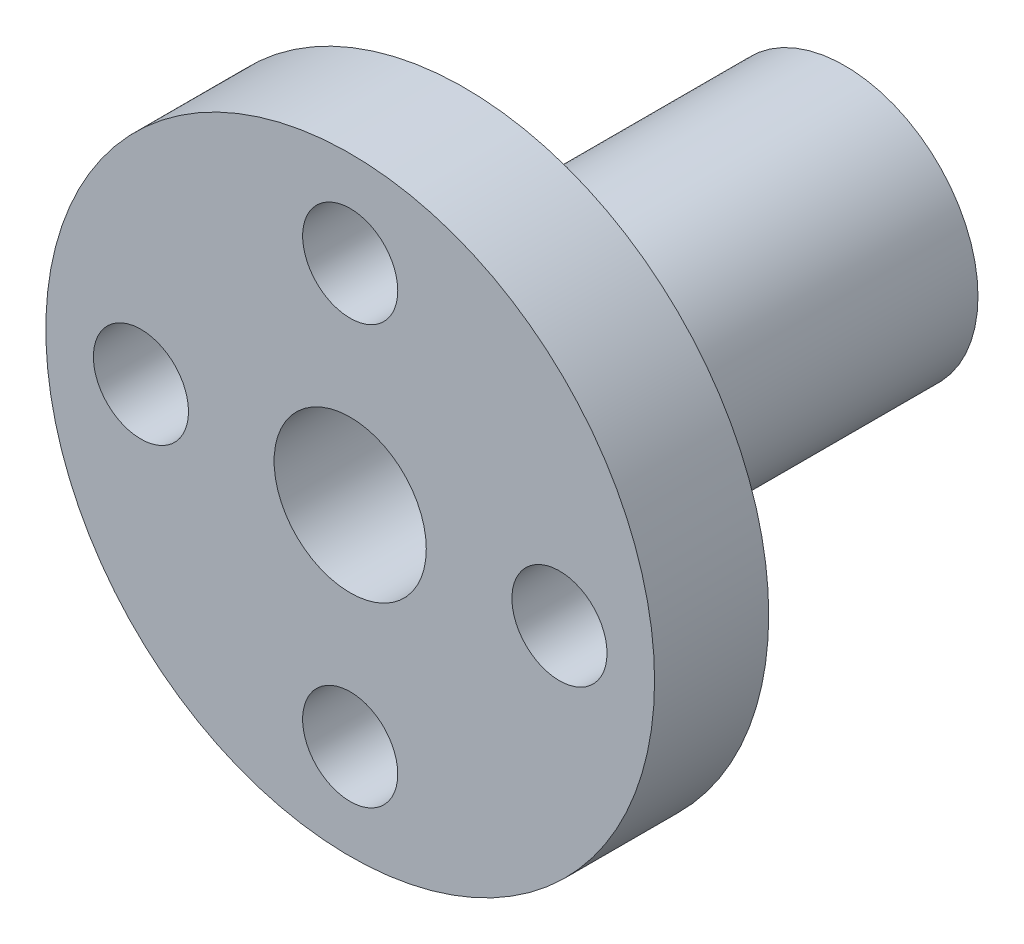
ISO-10303-21;
HEADER;
FILE_DESCRIPTION(('STEP AP214'),'2;1');
FILE_NAME('part.step','',(''),(''),'','','');
FILE_SCHEMA(('AUTOMOTIVE_DESIGN { 1 0 10303 214 1 1 1 1 }'));
ENDSEC;
DATA;
#1=APPLICATION_CONTEXT('core data for automotive mechanical design processes');
#2=APPLICATION_PROTOCOL_DEFINITION('international standard','automotive_design',2000,#1);
#3=PRODUCT_CONTEXT('',#1,'mechanical');
#4=PRODUCT('Part','Part','',(#3));
#5=PRODUCT_RELATED_PRODUCT_CATEGORY('part','',(#4));
#6=PRODUCT_DEFINITION_FORMATION('','',#4);
#7=PRODUCT_DEFINITION_CONTEXT('part definition',#1,'design');
#8=PRODUCT_DEFINITION('design','',#6,#7);
#9=PRODUCT_DEFINITION_SHAPE('','',#8);
#10=(LENGTH_UNIT() NAMED_UNIT(*) SI_UNIT(.MILLI.,.METRE.));
#11=(NAMED_UNIT(*) PLANE_ANGLE_UNIT() SI_UNIT($,.RADIAN.));
#12=(NAMED_UNIT(*) SI_UNIT($,.STERADIAN.) SOLID_ANGLE_UNIT());
#13=UNCERTAINTY_MEASURE_WITH_UNIT(LENGTH_MEASURE(1.E-05),#10,'distance_accuracy_value','');
#14=(GEOMETRIC_REPRESENTATION_CONTEXT(3) GLOBAL_UNCERTAINTY_ASSIGNED_CONTEXT((#13)) GLOBAL_UNIT_ASSIGNED_CONTEXT((#10,
#11,#12)) REPRESENTATION_CONTEXT('',''));
#15=CARTESIAN_POINT('',(0.,0.,0.));
#16=DIRECTION('',(0.,0.,1.));
#17=DIRECTION('',(1.,0.,0.));
#18=AXIS2_PLACEMENT_3D('',#15,#16,#17);
#19=CARTESIAN_POINT('',(0.,0.,3.));
#20=DIRECTION('',(0.,0.,1.));
#21=DIRECTION('',(1.,0.,0.));
#22=AXIS2_PLACEMENT_3D('',#19,#20,#21);
#23=PLANE('',#22);
#24=CARTESIAN_POINT('',(0.,0.,3.));
#25=DIRECTION('',(0.,0.,1.));
#26=DIRECTION('',(1.,0.,0.));
#27=AXIS2_PLACEMENT_3D('',#24,#25,#26);
#28=CIRCLE('',#27,2.);
#29=CARTESIAN_POINT('',(2.,0.,3.));
#30=VERTEX_POINT('',#29);
#31=EDGE_CURVE('E96',#30,#30,#28,.T.);
#32=ORIENTED_EDGE('',*,*,#31,.F.);
#33=EDGE_LOOP('',(#32));
#34=FACE_BOUND('',#33,.T.);
#35=CARTESIAN_POINT('',(0.,-5.5,3.));
#36=DIRECTION('',(0.,0.,1.));
#37=DIRECTION('',(1.,0.,0.));
#38=AXIS2_PLACEMENT_3D('',#35,#36,#37);
#39=CIRCLE('',#38,1.25);
#40=CARTESIAN_POINT('',(1.25,-5.5,3.));
#41=VERTEX_POINT('',#40);
#42=EDGE_CURVE('E68',#41,#41,#39,.T.);
#43=ORIENTED_EDGE('',*,*,#42,.F.);
#44=EDGE_LOOP('',(#43));
#45=FACE_BOUND('',#44,.T.);
#46=CARTESIAN_POINT('',(0.,5.5,3.));
#47=DIRECTION('',(0.,0.,1.));
#48=DIRECTION('',(1.,0.,0.));
#49=AXIS2_PLACEMENT_3D('',#46,#47,#48);
#50=CIRCLE('',#49,1.25);
#51=CARTESIAN_POINT('',(1.25,5.5,3.));
#52=VERTEX_POINT('',#51);
#53=EDGE_CURVE('E54',#52,#52,#50,.T.);
#54=ORIENTED_EDGE('',*,*,#53,.F.);
#55=EDGE_LOOP('',(#54));
#56=FACE_BOUND('',#55,.T.);
#57=CARTESIAN_POINT('',(0.,0.,3.));
#58=DIRECTION('',(0.,0.,1.));
#59=DIRECTION('',(1.,0.,0.));
#60=AXIS2_PLACEMENT_3D('',#57,#58,#59);
#61=CIRCLE('',#60,8.);
#62=CARTESIAN_POINT('',(8.,0.,3.));
#63=VERTEX_POINT('',#62);
#64=EDGE_CURVE('E10',#63,#63,#61,.T.);
#65=ORIENTED_EDGE('',*,*,#64,.T.);
#66=EDGE_LOOP('',(#65));
#67=FACE_BOUND('',#66,.T.);
#68=CARTESIAN_POINT('',(5.5,0.,3.));
#69=DIRECTION('',(0.,0.,1.));
#70=DIRECTION('',(1.,0.,0.));
#71=AXIS2_PLACEMENT_3D('',#68,#69,#70);
#72=CIRCLE('',#71,1.25);
#73=CARTESIAN_POINT('',(6.75,0.,3.));
#74=VERTEX_POINT('',#73);
#75=EDGE_CURVE('E60',#74,#74,#72,.T.);
#76=ORIENTED_EDGE('',*,*,#75,.F.);
#77=EDGE_LOOP('',(#76));
#78=FACE_BOUND('',#77,.T.);
#79=CARTESIAN_POINT('',(-5.5,0.,3.));
#80=DIRECTION('',(0.,0.,1.));
#81=DIRECTION('',(1.,0.,0.));
#82=AXIS2_PLACEMENT_3D('',#79,#80,#81);
#83=CIRCLE('',#82,1.25);
#84=CARTESIAN_POINT('',(-4.25,0.,3.));
#85=VERTEX_POINT('',#84);
#86=EDGE_CURVE('E76',#85,#85,#83,.T.);
#87=ORIENTED_EDGE('',*,*,#86,.F.);
#88=EDGE_LOOP('',(#87));
#89=FACE_BOUND('',#88,.T.);
#90=ADVANCED_FACE('F41',(#34,#45,#56,#67,#78,#89),#23,.T.);
#91=CARTESIAN_POINT('',(0.,0.,0.));
#92=DIRECTION('',(0.,0.,1.));
#93=DIRECTION('',(1.,0.,0.));
#94=AXIS2_PLACEMENT_3D('',#91,#92,#93);
#95=PLANE('',#94);
#96=CARTESIAN_POINT('',(0.,0.,0.));
#97=DIRECTION('',(0.,0.,1.));
#98=DIRECTION('',(1.,0.,0.));
#99=AXIS2_PLACEMENT_3D('',#96,#97,#98);
#100=CIRCLE('',#99,3.5);
#101=CARTESIAN_POINT('',(3.5,0.,0.));
#102=VERTEX_POINT('',#101);
#103=EDGE_CURVE('E88',#102,#102,#100,.T.);
#104=ORIENTED_EDGE('',*,*,#103,.T.);
#105=EDGE_LOOP('',(#104));
#106=FACE_BOUND('',#105,.T.);
#107=CARTESIAN_POINT('',(0.,0.,0.));
#108=DIRECTION('',(0.,0.,1.));
#109=DIRECTION('',(1.,0.,0.));
#110=AXIS2_PLACEMENT_3D('',#107,#108,#109);
#111=CIRCLE('',#110,8.);
#112=CARTESIAN_POINT('',(8.,0.,0.));
#113=VERTEX_POINT('',#112);
#114=EDGE_CURVE('E45',#113,#113,#111,.T.);
#115=ORIENTED_EDGE('',*,*,#114,.F.);
#116=EDGE_LOOP('',(#115));
#117=FACE_BOUND('',#116,.T.);
#118=CARTESIAN_POINT('',(0.,5.5,0.));
#119=DIRECTION('',(0.,0.,1.));
#120=DIRECTION('',(1.,0.,0.));
#121=AXIS2_PLACEMENT_3D('',#118,#119,#120);
#122=CIRCLE('',#121,1.25);
#123=CARTESIAN_POINT('',(1.25,5.5,0.));
#124=VERTEX_POINT('',#123);
#125=EDGE_CURVE('E56',#124,#124,#122,.T.);
#126=ORIENTED_EDGE('',*,*,#125,.T.);
#127=EDGE_LOOP('',(#126));
#128=FACE_BOUND('',#127,.T.);
#129=CARTESIAN_POINT('',(5.5,0.,0.));
#130=DIRECTION('',(0.,0.,1.));
#131=DIRECTION('',(1.,0.,0.));
#132=AXIS2_PLACEMENT_3D('',#129,#130,#131);
#133=CIRCLE('',#132,1.25);
#134=CARTESIAN_POINT('',(6.75,0.,0.));
#135=VERTEX_POINT('',#134);
#136=EDGE_CURVE('E64',#135,#135,#133,.T.);
#137=ORIENTED_EDGE('',*,*,#136,.T.);
#138=EDGE_LOOP('',(#137));
#139=FACE_BOUND('',#138,.T.);
#140=CARTESIAN_POINT('',(0.,-5.5,0.));
#141=DIRECTION('',(0.,0.,1.));
#142=DIRECTION('',(1.,0.,0.));
#143=AXIS2_PLACEMENT_3D('',#140,#141,#142);
#144=CIRCLE('',#143,1.25);
#145=CARTESIAN_POINT('',(1.25,-5.5,0.));
#146=VERTEX_POINT('',#145);
#147=EDGE_CURVE('E72',#146,#146,#144,.T.);
#148=ORIENTED_EDGE('',*,*,#147,.T.);
#149=EDGE_LOOP('',(#148));
#150=FACE_BOUND('',#149,.T.);
#151=CARTESIAN_POINT('',(-5.5,0.,0.));
#152=DIRECTION('',(0.,0.,1.));
#153=DIRECTION('',(1.,0.,0.));
#154=AXIS2_PLACEMENT_3D('',#151,#152,#153);
#155=CIRCLE('',#154,1.25);
#156=CARTESIAN_POINT('',(-4.25,0.,0.));
#157=VERTEX_POINT('',#156);
#158=EDGE_CURVE('E80',#157,#157,#155,.T.);
#159=ORIENTED_EDGE('',*,*,#158,.T.);
#160=EDGE_LOOP('',(#159));
#161=FACE_BOUND('',#160,.T.);
#162=ADVANCED_FACE('F115',(#106,#117,#128,#139,#150,#161),#95,.F.);
#163=CARTESIAN_POINT('',(0.,0.,3.));
#164=DIRECTION('',(0.,0.,-1.));
#165=DIRECTION('',(-1.,0.,0.));
#166=AXIS2_PLACEMENT_3D('',#163,#164,#165);
#167=CYLINDRICAL_SURFACE('',#166,8.);
#168=ORIENTED_EDGE('',*,*,#64,.F.);
#169=EDGE_LOOP('',(#168));
#170=FACE_BOUND('',#169,.T.);
#171=ORIENTED_EDGE('',*,*,#114,.T.);
#172=EDGE_LOOP('',(#171));
#173=FACE_BOUND('',#172,.T.);
#174=ADVANCED_FACE('F43',(#170,#173),#167,.T.);
#175=CARTESIAN_POINT('',(0.,5.5,3.));
#176=DIRECTION('',(0.,0.,-1.));
#177=DIRECTION('',(-1.,0.,0.));
#178=AXIS2_PLACEMENT_3D('',#175,#176,#177);
#179=CYLINDRICAL_SURFACE('',#178,1.25);
#180=ORIENTED_EDGE('',*,*,#53,.T.);
#181=EDGE_LOOP('',(#180));
#182=FACE_BOUND('',#181,.T.);
#183=ORIENTED_EDGE('',*,*,#125,.F.);
#184=EDGE_LOOP('',(#183));
#185=FACE_BOUND('',#184,.T.);
#186=ADVANCED_FACE('F138',(#182,#185),#179,.F.);
#187=CARTESIAN_POINT('',(5.5,0.,3.));
#188=DIRECTION('',(0.,0.,-1.));
#189=DIRECTION('',(-1.,0.,0.));
#190=AXIS2_PLACEMENT_3D('',#187,#188,#189);
#191=CYLINDRICAL_SURFACE('',#190,1.25);
#192=ORIENTED_EDGE('',*,*,#75,.T.);
#193=EDGE_LOOP('',(#192));
#194=FACE_BOUND('',#193,.T.);
#195=ORIENTED_EDGE('',*,*,#136,.F.);
#196=EDGE_LOOP('',(#195));
#197=FACE_BOUND('',#196,.T.);
#198=ADVANCED_FACE('F144',(#194,#197),#191,.F.);
#199=CARTESIAN_POINT('',(0.,-5.5,3.));
#200=DIRECTION('',(0.,0.,-1.));
#201=DIRECTION('',(-1.,0.,0.));
#202=AXIS2_PLACEMENT_3D('',#199,#200,#201);
#203=CYLINDRICAL_SURFACE('',#202,1.25);
#204=ORIENTED_EDGE('',*,*,#42,.T.);
#205=EDGE_LOOP('',(#204));
#206=FACE_BOUND('',#205,.T.);
#207=ORIENTED_EDGE('',*,*,#147,.F.);
#208=EDGE_LOOP('',(#207));
#209=FACE_BOUND('',#208,.T.);
#210=ADVANCED_FACE('F129',(#206,#209),#203,.F.);
#211=CARTESIAN_POINT('',(-5.5,0.,3.));
#212=DIRECTION('',(0.,0.,-1.));
#213=DIRECTION('',(-1.,0.,0.));
#214=AXIS2_PLACEMENT_3D('',#211,#212,#213);
#215=CYLINDRICAL_SURFACE('',#214,1.25);
#216=ORIENTED_EDGE('',*,*,#86,.T.);
#217=EDGE_LOOP('',(#216));
#218=FACE_BOUND('',#217,.T.);
#219=ORIENTED_EDGE('',*,*,#158,.F.);
#220=EDGE_LOOP('',(#219));
#221=FACE_BOUND('',#220,.T.);
#222=ADVANCED_FACE('F125',(#218,#221),#215,.F.);
#223=CARTESIAN_POINT('',(0.,0.,-10.));
#224=DIRECTION('',(0.,0.,1.));
#225=DIRECTION('',(1.,0.,0.));
#226=AXIS2_PLACEMENT_3D('',#223,#224,#225);
#227=CYLINDRICAL_SURFACE('',#226,3.5);
#228=CARTESIAN_POINT('',(0.,0.,-10.));
#229=DIRECTION('',(0.,0.,1.));
#230=DIRECTION('',(1.,0.,0.));
#231=AXIS2_PLACEMENT_3D('',#228,#229,#230);
#232=CIRCLE('',#231,3.5);
#233=CARTESIAN_POINT('',(3.5,0.,-10.));
#234=VERTEX_POINT('',#233);
#235=EDGE_CURVE('E84',#234,#234,#232,.T.);
#236=ORIENTED_EDGE('',*,*,#235,.T.);
#237=EDGE_LOOP('',(#236));
#238=FACE_BOUND('',#237,.T.);
#239=ORIENTED_EDGE('',*,*,#103,.F.);
#240=EDGE_LOOP('',(#239));
#241=FACE_BOUND('',#240,.T.);
#242=ADVANCED_FACE('F128',(#238,#241),#227,.T.);
#243=CARTESIAN_POINT('',(0.,0.,-10.));
#244=DIRECTION('',(0.,0.,1.));
#245=DIRECTION('',(1.,0.,0.));
#246=AXIS2_PLACEMENT_3D('',#243,#244,#245);
#247=PLANE('',#246);
#248=CARTESIAN_POINT('',(0.,0.,-10.));
#249=DIRECTION('',(0.,0.,1.));
#250=DIRECTION('',(1.,0.,0.));
#251=AXIS2_PLACEMENT_3D('',#248,#249,#250);
#252=CIRCLE('',#251,2.);
#253=CARTESIAN_POINT('',(2.,0.,-10.));
#254=VERTEX_POINT('',#253);
#255=EDGE_CURVE('E92',#254,#254,#252,.T.);
#256=ORIENTED_EDGE('',*,*,#255,.T.);
#257=EDGE_LOOP('',(#256));
#258=FACE_BOUND('',#257,.T.);
#259=ORIENTED_EDGE('',*,*,#235,.F.);
#260=EDGE_LOOP('',(#259));
#261=FACE_BOUND('',#260,.T.);
#262=ADVANCED_FACE('F104',(#258,#261),#247,.F.);
#263=CARTESIAN_POINT('',(0.,0.,-10.));
#264=DIRECTION('',(0.,0.,1.));
#265=DIRECTION('',(1.,0.,0.));
#266=AXIS2_PLACEMENT_3D('',#263,#264,#265);
#267=CYLINDRICAL_SURFACE('',#266,2.);
#268=ORIENTED_EDGE('',*,*,#255,.F.);
#269=EDGE_LOOP('',(#268));
#270=FACE_BOUND('',#269,.T.);
#271=ORIENTED_EDGE('',*,*,#31,.T.);
#272=EDGE_LOOP('',(#271));
#273=FACE_BOUND('',#272,.T.);
#274=ADVANCED_FACE('F107',(#270,#273),#267,.F.);
#275=CLOSED_SHELL('',(#90,#162,#174,#186,#198,#210,#222,#242,#262,#274));
#276=MANIFOLD_SOLID_BREP('B2',#275);
#277=ADVANCED_BREP_SHAPE_REPRESENTATION('',(#18,#276),#14);
#278=SHAPE_DEFINITION_REPRESENTATION(#9,#277);
ENDSEC;
END-ISO-10303-21;
